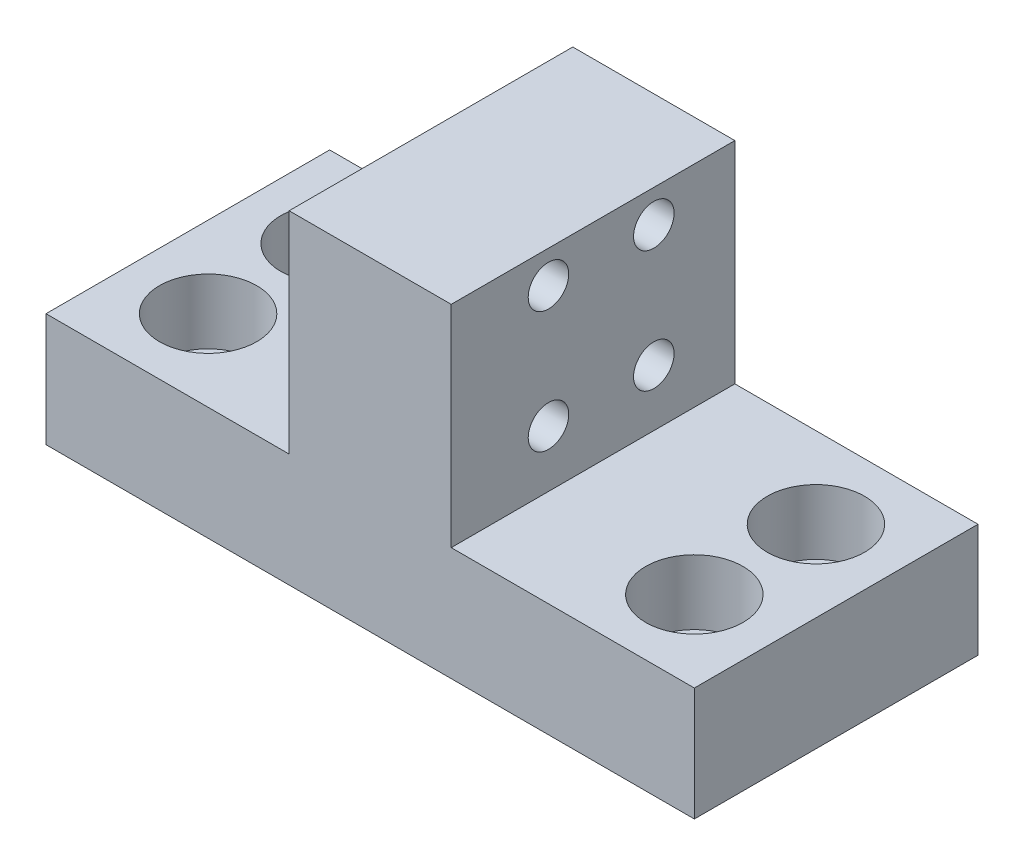
ISO-10303-21;
HEADER;
FILE_DESCRIPTION(('STEP AP214'),'2;1');
FILE_NAME('part.step','',(''),(''),'','','');
FILE_SCHEMA(('AUTOMOTIVE_DESIGN { 1 0 10303 214 1 1 1 1 }'));
ENDSEC;
DATA;
#1=APPLICATION_CONTEXT('core data for automotive mechanical design processes');
#2=APPLICATION_PROTOCOL_DEFINITION('international standard','automotive_design',2000,#1);
#3=PRODUCT_CONTEXT('',#1,'mechanical');
#4=PRODUCT('Part','Part','',(#3));
#5=PRODUCT_RELATED_PRODUCT_CATEGORY('part','',(#4));
#6=PRODUCT_DEFINITION_FORMATION('','',#4);
#7=PRODUCT_DEFINITION_CONTEXT('part definition',#1,'design');
#8=PRODUCT_DEFINITION('design','',#6,#7);
#9=PRODUCT_DEFINITION_SHAPE('','',#8);
#10=(LENGTH_UNIT() NAMED_UNIT(*) SI_UNIT(.MILLI.,.METRE.));
#11=(NAMED_UNIT(*) PLANE_ANGLE_UNIT() SI_UNIT($,.RADIAN.));
#12=(NAMED_UNIT(*) SI_UNIT($,.STERADIAN.) SOLID_ANGLE_UNIT());
#13=UNCERTAINTY_MEASURE_WITH_UNIT(LENGTH_MEASURE(1.E-05),#10,'distance_accuracy_value','');
#14=(GEOMETRIC_REPRESENTATION_CONTEXT(3) GLOBAL_UNCERTAINTY_ASSIGNED_CONTEXT((#13)) GLOBAL_UNIT_ASSIGNED_CONTEXT((#10,
#11,#12)) REPRESENTATION_CONTEXT('',''));
#15=CARTESIAN_POINT('',(0.,0.,0.));
#16=DIRECTION('',(0.,0.,1.));
#17=DIRECTION('',(1.,0.,0.));
#18=AXIS2_PLACEMENT_3D('',#15,#16,#17);
#19=CARTESIAN_POINT('',(40.,36.,5.5));
#20=DIRECTION('',(-1.,0.,0.));
#21=DIRECTION('',(0.,0.,1.));
#22=AXIS2_PLACEMENT_3D('',#19,#20,#21);
#23=CYLINDRICAL_SURFACE('',#22,2.5);
#24=CARTESIAN_POINT('',(-10.,36.,5.5));
#25=DIRECTION('',(-1.,0.,0.));
#26=DIRECTION('',(0.,0.,1.));
#27=AXIS2_PLACEMENT_3D('',#24,#25,#26);
#28=CIRCLE('',#27,2.5);
#29=CARTESIAN_POINT('',(-10.,36.,8.));
#30=VERTEX_POINT('',#29);
#31=EDGE_CURVE('E42',#30,#30,#28,.T.);
#32=ORIENTED_EDGE('',*,*,#31,.T.);
#33=EDGE_LOOP('',(#32));
#34=FACE_BOUND('',#33,.T.);
#35=CARTESIAN_POINT('',(10.,36.,5.5));
#36=DIRECTION('',(-1.,0.,0.));
#37=DIRECTION('',(0.,0.,1.));
#38=AXIS2_PLACEMENT_3D('',#35,#36,#37);
#39=CIRCLE('',#38,2.5);
#40=CARTESIAN_POINT('',(10.,36.,8.));
#41=VERTEX_POINT('',#40);
#42=EDGE_CURVE('E11',#41,#41,#39,.T.);
#43=ORIENTED_EDGE('',*,*,#42,.F.);
#44=EDGE_LOOP('',(#43));
#45=FACE_BOUND('',#44,.T.);
#46=ADVANCED_FACE('F35',(#34,#45),#23,.F.);
#47=CARTESIAN_POINT('',(40.,36.,-7.5));
#48=DIRECTION('',(-1.,0.,0.));
#49=DIRECTION('',(0.,0.,1.));
#50=AXIS2_PLACEMENT_3D('',#47,#48,#49);
#51=CYLINDRICAL_SURFACE('',#50,2.5);
#52=CARTESIAN_POINT('',(-10.,36.,-7.5));
#53=DIRECTION('',(-1.,0.,0.));
#54=DIRECTION('',(0.,0.,1.));
#55=AXIS2_PLACEMENT_3D('',#52,#53,#54);
#56=CIRCLE('',#55,2.5);
#57=CARTESIAN_POINT('',(-10.,36.,-5.));
#58=VERTEX_POINT('',#57);
#59=EDGE_CURVE('E158',#58,#58,#56,.T.);
#60=ORIENTED_EDGE('',*,*,#59,.T.);
#61=EDGE_LOOP('',(#60));
#62=FACE_BOUND('',#61,.T.);
#63=CARTESIAN_POINT('',(10.,36.,-7.5));
#64=DIRECTION('',(-1.,0.,0.));
#65=DIRECTION('',(0.,0.,1.));
#66=AXIS2_PLACEMENT_3D('',#63,#64,#65);
#67=CIRCLE('',#66,2.5);
#68=CARTESIAN_POINT('',(10.,36.,-5.));
#69=VERTEX_POINT('',#68);
#70=EDGE_CURVE('E166',#69,#69,#67,.T.);
#71=ORIENTED_EDGE('',*,*,#70,.F.);
#72=EDGE_LOOP('',(#71));
#73=FACE_BOUND('',#72,.T.);
#74=ADVANCED_FACE('F191',(#62,#73),#51,.F.);
#75=CARTESIAN_POINT('',(0.,14.,0.));
#76=DIRECTION('',(0.,1.,0.));
#77=DIRECTION('',(0.,0.,1.));
#78=AXIS2_PLACEMENT_3D('',#75,#76,#77);
#79=PLANE('',#78);
#80=CARTESIAN_POINT('',(30.,14.,7.5));
#81=DIRECTION('',(0.,1.,0.));
#82=DIRECTION('',(0.,0.,1.));
#83=AXIS2_PLACEMENT_3D('',#80,#81,#82);
#84=CIRCLE('',#83,6.);
#85=CARTESIAN_POINT('',(30.,14.,13.5));
#86=VERTEX_POINT('',#85);
#87=EDGE_CURVE('E162',#86,#86,#84,.T.);
#88=ORIENTED_EDGE('',*,*,#87,.F.);
#89=EDGE_LOOP('',(#88));
#90=FACE_BOUND('',#89,.T.);
#91=CARTESIAN_POINT('',(30.,14.,-7.5));
#92=DIRECTION('',(0.,1.,0.));
#93=DIRECTION('',(0.,0.,1.));
#94=AXIS2_PLACEMENT_3D('',#91,#92,#93);
#95=CIRCLE('',#94,6.);
#96=CARTESIAN_POINT('',(30.,14.,-1.5));
#97=VERTEX_POINT('',#96);
#98=EDGE_CURVE('E477',#97,#97,#95,.T.);
#99=ORIENTED_EDGE('',*,*,#98,.F.);
#100=EDGE_LOOP('',(#99));
#101=FACE_BOUND('',#100,.T.);
#102=DIRECTION('',(0.,0.,-1.));
#103=VECTOR('',#102,1.);
#104=CARTESIAN_POINT('',(10.,14.,17.5));
#105=LINE('',#104,#103);
#106=CARTESIAN_POINT('',(10.,14.,17.5));
#107=VERTEX_POINT('',#106);
#108=CARTESIAN_POINT('',(10.,14.,-17.5));
#109=VERTEX_POINT('',#108);
#110=EDGE_CURVE('E49',#107,#109,#105,.T.);
#111=ORIENTED_EDGE('',*,*,#110,.F.);
#112=DIRECTION('',(1.,0.,0.));
#113=VECTOR('',#112,1.);
#114=CARTESIAN_POINT('',(-40.,14.,17.5));
#115=LINE('',#114,#113);
#116=CARTESIAN_POINT('',(40.,14.,17.5));
#117=VERTEX_POINT('',#116);
#118=EDGE_CURVE('E136',#107,#117,#115,.T.);
#119=ORIENTED_EDGE('',*,*,#118,.T.);
#120=DIRECTION('',(0.,0.,-1.));
#121=VECTOR('',#120,1.);
#122=CARTESIAN_POINT('',(40.,14.,17.5));
#123=LINE('',#122,#121);
#124=CARTESIAN_POINT('',(40.,14.,-17.5));
#125=VERTEX_POINT('',#124);
#126=EDGE_CURVE('E139',#117,#125,#123,.T.);
#127=ORIENTED_EDGE('',*,*,#126,.T.);
#128=DIRECTION('',(-1.,0.,0.));
#129=VECTOR('',#128,1.);
#130=CARTESIAN_POINT('',(40.,14.,-17.5));
#131=LINE('',#130,#129);
#132=EDGE_CURVE('E132',#125,#109,#131,.T.);
#133=ORIENTED_EDGE('',*,*,#132,.T.);
#134=EDGE_LOOP('',(#111,#119,#127,#133));
#135=FACE_BOUND('',#134,.T.);
#136=ADVANCED_FACE('F195',(#90,#101,#135),#79,.T.);
#137=CARTESIAN_POINT('',(40.,14.,-17.5));
#138=DIRECTION('',(0.,0.,1.));
#139=DIRECTION('',(1.,0.,0.));
#140=AXIS2_PLACEMENT_3D('',#137,#138,#139);
#141=PLANE('',#140);
#142=DIRECTION('',(-1.,0.,0.));
#143=VECTOR('',#142,1.);
#144=CARTESIAN_POINT('',(40.,0.,-17.5));
#145=LINE('',#144,#143);
#146=CARTESIAN_POINT('',(40.,0.,-17.5));
#147=VERTEX_POINT('',#146);
#148=CARTESIAN_POINT('',(-40.,0.,-17.5));
#149=VERTEX_POINT('',#148);
#150=EDGE_CURVE('E124',#147,#149,#145,.T.);
#151=ORIENTED_EDGE('',*,*,#150,.T.);
#152=DIRECTION('',(0.,-1.,0.));
#153=VECTOR('',#152,1.);
#154=CARTESIAN_POINT('',(-40.,14.,-17.5));
#155=LINE('',#154,#153);
#156=CARTESIAN_POINT('',(-40.,14.,-17.5));
#157=VERTEX_POINT('',#156);
#158=EDGE_CURVE('E155',#157,#149,#155,.T.);
#159=ORIENTED_EDGE('',*,*,#158,.F.);
#160=CARTESIAN_POINT('',(-10.,14.,-17.5));
#161=VERTEX_POINT('',#160);
#162=EDGE_CURVE('E123',#161,#157,#131,.T.);
#163=ORIENTED_EDGE('',*,*,#162,.F.);
#164=DIRECTION('',(0.,-1.,0.));
#165=VECTOR('',#164,1.);
#166=CARTESIAN_POINT('',(-10.,40.,-17.5));
#167=LINE('',#166,#165);
#168=CARTESIAN_POINT('',(-10.,40.,-17.5));
#169=VERTEX_POINT('',#168);
#170=EDGE_CURVE('E104',#169,#161,#167,.T.);
#171=ORIENTED_EDGE('',*,*,#170,.F.);
#172=DIRECTION('',(-1.,0.,0.));
#173=VECTOR('',#172,1.);
#174=CARTESIAN_POINT('',(10.,40.,-17.5));
#175=LINE('',#174,#173);
#176=CARTESIAN_POINT('',(10.,40.,-17.5));
#177=VERTEX_POINT('',#176);
#178=EDGE_CURVE('E110',#177,#169,#175,.T.);
#179=ORIENTED_EDGE('',*,*,#178,.F.);
#180=DIRECTION('',(0.,-1.,0.));
#181=VECTOR('',#180,1.);
#182=CARTESIAN_POINT('',(10.,40.,-17.5));
#183=LINE('',#182,#181);
#184=EDGE_CURVE('E246',#177,#109,#183,.T.);
#185=ORIENTED_EDGE('',*,*,#184,.T.);
#186=ORIENTED_EDGE('',*,*,#132,.F.);
#187=DIRECTION('',(0.,-1.,0.));
#188=VECTOR('',#187,1.);
#189=CARTESIAN_POINT('',(40.,14.,-17.5));
#190=LINE('',#189,#188);
#191=EDGE_CURVE('E140',#125,#147,#190,.T.);
#192=ORIENTED_EDGE('',*,*,#191,.T.);
#193=EDGE_LOOP('',(#151,#159,#163,#171,#179,#185,#186,#192));
#194=FACE_BOUND('',#193,.T.);
#195=ADVANCED_FACE('F121',(#194),#141,.F.);
#196=CARTESIAN_POINT('',(-40.,14.,-17.5));
#197=DIRECTION('',(1.,0.,0.));
#198=DIRECTION('',(0.,0.,-1.));
#199=AXIS2_PLACEMENT_3D('',#196,#197,#198);
#200=PLANE('',#199);
#201=DIRECTION('',(0.,0.,1.));
#202=VECTOR('',#201,1.);
#203=CARTESIAN_POINT('',(-40.,0.,-17.5));
#204=LINE('',#203,#202);
#205=CARTESIAN_POINT('',(-40.,0.,17.5));
#206=VERTEX_POINT('',#205);
#207=EDGE_CURVE('E126',#149,#206,#204,.T.);
#208=ORIENTED_EDGE('',*,*,#207,.T.);
#209=DIRECTION('',(0.,-1.,0.));
#210=VECTOR('',#209,1.);
#211=CARTESIAN_POINT('',(-40.,14.,17.5));
#212=LINE('',#211,#210);
#213=CARTESIAN_POINT('',(-40.,14.,17.5));
#214=VERTEX_POINT('',#213);
#215=EDGE_CURVE('E152',#214,#206,#212,.T.);
#216=ORIENTED_EDGE('',*,*,#215,.F.);
#217=DIRECTION('',(0.,0.,1.));
#218=VECTOR('',#217,1.);
#219=CARTESIAN_POINT('',(-40.,14.,-17.5));
#220=LINE('',#219,#218);
#221=EDGE_CURVE('E134',#157,#214,#220,.T.);
#222=ORIENTED_EDGE('',*,*,#221,.F.);
#223=ORIENTED_EDGE('',*,*,#158,.T.);
#224=EDGE_LOOP('',(#208,#216,#222,#223));
#225=FACE_BOUND('',#224,.T.);
#226=ADVANCED_FACE('F205',(#225),#200,.F.);
#227=CARTESIAN_POINT('',(-40.,14.,17.5));
#228=DIRECTION('',(0.,0.,-1.));
#229=DIRECTION('',(-1.,0.,0.));
#230=AXIS2_PLACEMENT_3D('',#227,#228,#229);
#231=PLANE('',#230);
#232=DIRECTION('',(1.,0.,0.));
#233=VECTOR('',#232,1.);
#234=CARTESIAN_POINT('',(-40.,0.,17.5));
#235=LINE('',#234,#233);
#236=CARTESIAN_POINT('',(40.,0.,17.5));
#237=VERTEX_POINT('',#236);
#238=EDGE_CURVE('E143',#206,#237,#235,.T.);
#239=ORIENTED_EDGE('',*,*,#238,.T.);
#240=DIRECTION('',(0.,-1.,0.));
#241=VECTOR('',#240,1.);
#242=CARTESIAN_POINT('',(40.,14.,17.5));
#243=LINE('',#242,#241);
#244=EDGE_CURVE('E149',#117,#237,#243,.T.);
#245=ORIENTED_EDGE('',*,*,#244,.F.);
#246=ORIENTED_EDGE('',*,*,#118,.F.);
#247=DIRECTION('',(0.,-1.,0.));
#248=VECTOR('',#247,1.);
#249=CARTESIAN_POINT('',(10.,40.,17.5));
#250=LINE('',#249,#248);
#251=CARTESIAN_POINT('',(10.,40.,17.5));
#252=VERTEX_POINT('',#251);
#253=EDGE_CURVE('E128',#252,#107,#250,.T.);
#254=ORIENTED_EDGE('',*,*,#253,.F.);
#255=DIRECTION('',(1.,0.,0.));
#256=VECTOR('',#255,1.);
#257=CARTESIAN_POINT('',(10.,40.,17.5));
#258=LINE('',#257,#256);
#259=CARTESIAN_POINT('',(-10.,40.,17.5));
#260=VERTEX_POINT('',#259);
#261=EDGE_CURVE('E109',#260,#252,#258,.T.);
#262=ORIENTED_EDGE('',*,*,#261,.F.);
#263=DIRECTION('',(0.,-1.,0.));
#264=VECTOR('',#263,1.);
#265=CARTESIAN_POINT('',(-10.,40.,17.5));
#266=LINE('',#265,#264);
#267=CARTESIAN_POINT('',(-10.,14.,17.5));
#268=VERTEX_POINT('',#267);
#269=EDGE_CURVE('E106',#260,#268,#266,.T.);
#270=ORIENTED_EDGE('',*,*,#269,.T.);
#271=EDGE_CURVE('E137',#214,#268,#115,.T.);
#272=ORIENTED_EDGE('',*,*,#271,.F.);
#273=ORIENTED_EDGE('',*,*,#215,.T.);
#274=EDGE_LOOP('',(#239,#245,#246,#254,#262,#270,#272,#273));
#275=FACE_BOUND('',#274,.T.);
#276=ADVANCED_FACE('F208',(#275),#231,.F.);
#277=CARTESIAN_POINT('',(40.,14.,17.5));
#278=DIRECTION('',(-1.,0.,0.));
#279=DIRECTION('',(0.,0.,1.));
#280=AXIS2_PLACEMENT_3D('',#277,#278,#279);
#281=PLANE('',#280);
#282=DIRECTION('',(0.,0.,-1.));
#283=VECTOR('',#282,1.);
#284=CARTESIAN_POINT('',(40.,0.,17.5));
#285=LINE('',#284,#283);
#286=EDGE_CURVE('E145',#237,#147,#285,.T.);
#287=ORIENTED_EDGE('',*,*,#286,.T.);
#288=ORIENTED_EDGE('',*,*,#191,.F.);
#289=ORIENTED_EDGE('',*,*,#126,.F.);
#290=ORIENTED_EDGE('',*,*,#244,.T.);
#291=EDGE_LOOP('',(#287,#288,#289,#290));
#292=FACE_BOUND('',#291,.T.);
#293=ADVANCED_FACE('F212',(#292),#281,.F.);
#294=CARTESIAN_POINT('',(-30.,14.,7.5));
#295=DIRECTION('',(0.,1.,0.));
#296=DIRECTION('',(0.,0.,1.));
#297=AXIS2_PLACEMENT_3D('',#294,#295,#296);
#298=CIRCLE('',#297,6.);
#299=CARTESIAN_POINT('',(-30.,14.,13.5));
#300=VERTEX_POINT('',#299);
#301=EDGE_CURVE('E223',#300,#300,#298,.T.);
#302=ORIENTED_EDGE('',*,*,#301,.F.);
#303=EDGE_LOOP('',(#302));
#304=FACE_BOUND('',#303,.T.);
#305=CARTESIAN_POINT('',(-30.,14.,-7.5));
#306=DIRECTION('',(0.,1.,0.));
#307=DIRECTION('',(0.,0.,1.));
#308=AXIS2_PLACEMENT_3D('',#305,#306,#307);
#309=CIRCLE('',#308,6.);
#310=CARTESIAN_POINT('',(-30.,14.,-1.5));
#311=VERTEX_POINT('',#310);
#312=EDGE_CURVE('E226',#311,#311,#309,.T.);
#313=ORIENTED_EDGE('',*,*,#312,.F.);
#314=EDGE_LOOP('',(#313));
#315=FACE_BOUND('',#314,.T.);
#316=DIRECTION('',(0.,0.,1.));
#317=VECTOR('',#316,1.);
#318=CARTESIAN_POINT('',(-10.,14.,-17.5));
#319=LINE('',#318,#317);
#320=EDGE_CURVE('E57',#161,#268,#319,.T.);
#321=ORIENTED_EDGE('',*,*,#320,.F.);
#322=ORIENTED_EDGE('',*,*,#162,.T.);
#323=ORIENTED_EDGE('',*,*,#221,.T.);
#324=ORIENTED_EDGE('',*,*,#271,.T.);
#325=EDGE_LOOP('',(#321,#322,#323,#324));
#326=FACE_BOUND('',#325,.T.);
#327=ADVANCED_FACE('F184',(#304,#315,#326),#79,.T.);
#328=CARTESIAN_POINT('',(0.,0.,0.));
#329=DIRECTION('',(0.,1.,0.));
#330=DIRECTION('',(0.,0.,1.));
#331=AXIS2_PLACEMENT_3D('',#328,#329,#330);
#332=PLANE('',#331);
#333=CARTESIAN_POINT('',(30.,0.,7.5));
#334=DIRECTION('',(0.,1.,0.));
#335=DIRECTION('',(0.,0.,1.));
#336=AXIS2_PLACEMENT_3D('',#333,#334,#335);
#337=CIRCLE('',#336,3.5);
#338=CARTESIAN_POINT('',(30.,0.,11.));
#339=VERTEX_POINT('',#338);
#340=EDGE_CURVE('E474',#339,#339,#337,.T.);
#341=ORIENTED_EDGE('',*,*,#340,.T.);
#342=EDGE_LOOP('',(#341));
#343=FACE_BOUND('',#342,.T.);
#344=CARTESIAN_POINT('',(30.,0.,-7.5));
#345=DIRECTION('',(0.,1.,0.));
#346=DIRECTION('',(0.,0.,1.));
#347=AXIS2_PLACEMENT_3D('',#344,#345,#346);
#348=CIRCLE('',#347,3.5);
#349=CARTESIAN_POINT('',(30.,0.,-4.));
#350=VERTEX_POINT('',#349);
#351=EDGE_CURVE('E486',#350,#350,#348,.T.);
#352=ORIENTED_EDGE('',*,*,#351,.T.);
#353=EDGE_LOOP('',(#352));
#354=FACE_BOUND('',#353,.T.);
#355=CARTESIAN_POINT('',(-30.,0.,7.5));
#356=DIRECTION('',(0.,1.,0.));
#357=DIRECTION('',(0.,0.,1.));
#358=AXIS2_PLACEMENT_3D('',#355,#356,#357);
#359=CIRCLE('',#358,3.5);
#360=CARTESIAN_POINT('',(-30.,0.,11.));
#361=VERTEX_POINT('',#360);
#362=EDGE_CURVE('E229',#361,#361,#359,.T.);
#363=ORIENTED_EDGE('',*,*,#362,.T.);
#364=EDGE_LOOP('',(#363));
#365=FACE_BOUND('',#364,.T.);
#366=CARTESIAN_POINT('',(-30.,0.,-7.5));
#367=DIRECTION('',(0.,1.,0.));
#368=DIRECTION('',(0.,0.,1.));
#369=AXIS2_PLACEMENT_3D('',#366,#367,#368);
#370=CIRCLE('',#369,3.5);
#371=CARTESIAN_POINT('',(-30.,0.,-4.));
#372=VERTEX_POINT('',#371);
#373=EDGE_CURVE('E241',#372,#372,#370,.T.);
#374=ORIENTED_EDGE('',*,*,#373,.T.);
#375=EDGE_LOOP('',(#374));
#376=FACE_BOUND('',#375,.T.);
#377=ORIENTED_EDGE('',*,*,#150,.F.);
#378=ORIENTED_EDGE('',*,*,#286,.F.);
#379=ORIENTED_EDGE('',*,*,#238,.F.);
#380=ORIENTED_EDGE('',*,*,#207,.F.);
#381=EDGE_LOOP('',(#377,#378,#379,#380));
#382=FACE_BOUND('',#381,.T.);
#383=ADVANCED_FACE('F175',(#343,#354,#365,#376,#382),#332,.F.);
#384=CARTESIAN_POINT('',(-10.,40.,-17.5));
#385=DIRECTION('',(1.,0.,0.));
#386=DIRECTION('',(0.,0.,-1.));
#387=AXIS2_PLACEMENT_3D('',#384,#385,#386);
#388=PLANE('',#387);
#389=CARTESIAN_POINT('',(-10.,21.,5.5));
#390=DIRECTION('',(-1.,0.,0.));
#391=DIRECTION('',(0.,0.,1.));
#392=AXIS2_PLACEMENT_3D('',#389,#390,#391);
#393=CIRCLE('',#392,2.5);
#394=CARTESIAN_POINT('',(-10.,21.,8.));
#395=VERTEX_POINT('',#394);
#396=EDGE_CURVE('E457',#395,#395,#393,.T.);
#397=ORIENTED_EDGE('',*,*,#396,.F.);
#398=EDGE_LOOP('',(#397));
#399=FACE_BOUND('',#398,.T.);
#400=CARTESIAN_POINT('',(-10.,21.,-7.5));
#401=DIRECTION('',(-1.,0.,0.));
#402=DIRECTION('',(0.,0.,1.));
#403=AXIS2_PLACEMENT_3D('',#400,#401,#402);
#404=CIRCLE('',#403,2.5);
#405=CARTESIAN_POINT('',(-10.,21.,-5.));
#406=VERTEX_POINT('',#405);
#407=EDGE_CURVE('E163',#406,#406,#404,.T.);
#408=ORIENTED_EDGE('',*,*,#407,.F.);
#409=EDGE_LOOP('',(#408));
#410=FACE_BOUND('',#409,.T.);
#411=ORIENTED_EDGE('',*,*,#320,.T.);
#412=ORIENTED_EDGE('',*,*,#269,.F.);
#413=DIRECTION('',(0.,0.,1.));
#414=VECTOR('',#413,1.);
#415=CARTESIAN_POINT('',(-10.,40.,-17.5));
#416=LINE('',#415,#414);
#417=EDGE_CURVE('E99',#169,#260,#416,.T.);
#418=ORIENTED_EDGE('',*,*,#417,.F.);
#419=ORIENTED_EDGE('',*,*,#170,.T.);
#420=EDGE_LOOP('',(#411,#412,#418,#419));
#421=FACE_BOUND('',#420,.T.);
#422=ORIENTED_EDGE('',*,*,#59,.F.);
#423=EDGE_LOOP('',(#422));
#424=FACE_BOUND('',#423,.T.);
#425=ORIENTED_EDGE('',*,*,#31,.F.);
#426=EDGE_LOOP('',(#425));
#427=FACE_BOUND('',#426,.T.);
#428=ADVANCED_FACE('F101',(#399,#410,#421,#424,#427),#388,.F.);
#429=CARTESIAN_POINT('',(10.,40.,17.5));
#430=DIRECTION('',(-1.,0.,0.));
#431=DIRECTION('',(0.,0.,1.));
#432=AXIS2_PLACEMENT_3D('',#429,#430,#431);
#433=PLANE('',#432);
#434=CARTESIAN_POINT('',(10.,21.,5.5));
#435=DIRECTION('',(-1.,0.,0.));
#436=DIRECTION('',(0.,0.,1.));
#437=AXIS2_PLACEMENT_3D('',#434,#435,#436);
#438=CIRCLE('',#437,2.5);
#439=CARTESIAN_POINT('',(10.,21.,8.));
#440=VERTEX_POINT('',#439);
#441=EDGE_CURVE('E460',#440,#440,#438,.T.);
#442=ORIENTED_EDGE('',*,*,#441,.T.);
#443=EDGE_LOOP('',(#442));
#444=FACE_BOUND('',#443,.T.);
#445=CARTESIAN_POINT('',(10.,21.,-7.5));
#446=DIRECTION('',(-1.,0.,0.));
#447=DIRECTION('',(0.,0.,1.));
#448=AXIS2_PLACEMENT_3D('',#445,#446,#447);
#449=CIRCLE('',#448,2.5);
#450=CARTESIAN_POINT('',(10.,21.,-5.));
#451=VERTEX_POINT('',#450);
#452=EDGE_CURVE('E159',#451,#451,#449,.T.);
#453=ORIENTED_EDGE('',*,*,#452,.T.);
#454=EDGE_LOOP('',(#453));
#455=FACE_BOUND('',#454,.T.);
#456=ORIENTED_EDGE('',*,*,#110,.T.);
#457=ORIENTED_EDGE('',*,*,#184,.F.);
#458=DIRECTION('',(0.,0.,-1.));
#459=VECTOR('',#458,1.);
#460=CARTESIAN_POINT('',(10.,40.,17.5));
#461=LINE('',#460,#459);
#462=EDGE_CURVE('E115',#252,#177,#461,.T.);
#463=ORIENTED_EDGE('',*,*,#462,.F.);
#464=ORIENTED_EDGE('',*,*,#253,.T.);
#465=EDGE_LOOP('',(#456,#457,#463,#464));
#466=FACE_BOUND('',#465,.T.);
#467=ORIENTED_EDGE('',*,*,#70,.T.);
#468=EDGE_LOOP('',(#467));
#469=FACE_BOUND('',#468,.T.);
#470=ORIENTED_EDGE('',*,*,#42,.T.);
#471=EDGE_LOOP('',(#470));
#472=FACE_BOUND('',#471,.T.);
#473=ADVANCED_FACE('F174',(#444,#455,#466,#469,#472),#433,.F.);
#474=CARTESIAN_POINT('',(0.,40.,0.));
#475=DIRECTION('',(0.,1.,0.));
#476=DIRECTION('',(0.,0.,1.));
#477=AXIS2_PLACEMENT_3D('',#474,#475,#476);
#478=PLANE('',#477);
#479=ORIENTED_EDGE('',*,*,#178,.T.);
#480=ORIENTED_EDGE('',*,*,#417,.T.);
#481=ORIENTED_EDGE('',*,*,#261,.T.);
#482=ORIENTED_EDGE('',*,*,#462,.T.);
#483=EDGE_LOOP('',(#479,#480,#481,#482));
#484=FACE_BOUND('',#483,.T.);
#485=ADVANCED_FACE('F113',(#484),#478,.T.);
#486=CARTESIAN_POINT('',(-30.,14.,-7.5));
#487=DIRECTION('',(0.,1.,0.));
#488=DIRECTION('',(0.,0.,1.));
#489=AXIS2_PLACEMENT_3D('',#486,#487,#488);
#490=CYLINDRICAL_SURFACE('',#489,3.5);
#491=ORIENTED_EDGE('',*,*,#373,.F.);
#492=EDGE_LOOP('',(#491));
#493=FACE_BOUND('',#492,.T.);
#494=CARTESIAN_POINT('',(-30.,6.,-7.5));
#495=DIRECTION('',(0.,1.,0.));
#496=DIRECTION('',(0.,0.,1.));
#497=AXIS2_PLACEMENT_3D('',#494,#495,#496);
#498=CIRCLE('',#497,3.5);
#499=CARTESIAN_POINT('',(-30.,6.,-4.));
#500=VERTEX_POINT('',#499);
#501=EDGE_CURVE('E232',#500,#500,#498,.T.);
#502=ORIENTED_EDGE('',*,*,#501,.T.);
#503=EDGE_LOOP('',(#502));
#504=FACE_BOUND('',#503,.T.);
#505=ADVANCED_FACE('F270',(#493,#504),#490,.F.);
#506=CARTESIAN_POINT('',(-26.5,6.,-7.5));
#507=DIRECTION('',(0.,-1.,0.));
#508=DIRECTION('',(0.,0.,-1.));
#509=AXIS2_PLACEMENT_3D('',#506,#507,#508);
#510=PLANE('',#509);
#511=ORIENTED_EDGE('',*,*,#501,.F.);
#512=EDGE_LOOP('',(#511));
#513=FACE_BOUND('',#512,.T.);
#514=CARTESIAN_POINT('',(-30.,6.,-7.5));
#515=DIRECTION('',(0.,1.,0.));
#516=DIRECTION('',(0.,0.,1.));
#517=AXIS2_PLACEMENT_3D('',#514,#515,#516);
#518=CIRCLE('',#517,6.);
#519=CARTESIAN_POINT('',(-30.,6.,-1.5));
#520=VERTEX_POINT('',#519);
#521=EDGE_CURVE('E228',#520,#520,#518,.T.);
#522=ORIENTED_EDGE('',*,*,#521,.T.);
#523=EDGE_LOOP('',(#522));
#524=FACE_BOUND('',#523,.T.);
#525=ADVANCED_FACE('F273',(#513,#524),#510,.F.);
#526=CARTESIAN_POINT('',(-30.,14.,-7.5));
#527=DIRECTION('',(0.,1.,0.));
#528=DIRECTION('',(0.,0.,1.));
#529=AXIS2_PLACEMENT_3D('',#526,#527,#528);
#530=CYLINDRICAL_SURFACE('',#529,6.);
#531=ORIENTED_EDGE('',*,*,#521,.F.);
#532=EDGE_LOOP('',(#531));
#533=FACE_BOUND('',#532,.T.);
#534=ORIENTED_EDGE('',*,*,#312,.T.);
#535=EDGE_LOOP('',(#534));
#536=FACE_BOUND('',#535,.T.);
#537=ADVANCED_FACE('F279',(#533,#536),#530,.F.);
#538=CARTESIAN_POINT('',(-30.,14.,7.5));
#539=DIRECTION('',(0.,1.,0.));
#540=DIRECTION('',(0.,0.,1.));
#541=AXIS2_PLACEMENT_3D('',#538,#539,#540);
#542=CYLINDRICAL_SURFACE('',#541,3.5);
#543=ORIENTED_EDGE('',*,*,#362,.F.);
#544=EDGE_LOOP('',(#543));
#545=FACE_BOUND('',#544,.T.);
#546=CARTESIAN_POINT('',(-30.,6.,7.5));
#547=DIRECTION('',(0.,1.,0.));
#548=DIRECTION('',(0.,0.,1.));
#549=AXIS2_PLACEMENT_3D('',#546,#547,#548);
#550=CIRCLE('',#549,3.5);
#551=CARTESIAN_POINT('',(-30.,6.,11.));
#552=VERTEX_POINT('',#551);
#553=EDGE_CURVE('E235',#552,#552,#550,.T.);
#554=ORIENTED_EDGE('',*,*,#553,.T.);
#555=EDGE_LOOP('',(#554));
#556=FACE_BOUND('',#555,.T.);
#557=ADVANCED_FACE('F284',(#545,#556),#542,.F.);
#558=CARTESIAN_POINT('',(-26.5,6.,7.5));
#559=DIRECTION('',(0.,-1.,0.));
#560=DIRECTION('',(0.,0.,-1.));
#561=AXIS2_PLACEMENT_3D('',#558,#559,#560);
#562=PLANE('',#561);
#563=ORIENTED_EDGE('',*,*,#553,.F.);
#564=EDGE_LOOP('',(#563));
#565=FACE_BOUND('',#564,.T.);
#566=CARTESIAN_POINT('',(-30.,6.,7.5));
#567=DIRECTION('',(0.,1.,0.));
#568=DIRECTION('',(0.,0.,1.));
#569=AXIS2_PLACEMENT_3D('',#566,#567,#568);
#570=CIRCLE('',#569,6.);
#571=CARTESIAN_POINT('',(-30.,6.,13.5));
#572=VERTEX_POINT('',#571);
#573=EDGE_CURVE('E490',#572,#572,#570,.T.);
#574=ORIENTED_EDGE('',*,*,#573,.T.);
#575=EDGE_LOOP('',(#574));
#576=FACE_BOUND('',#575,.T.);
#577=ADVANCED_FACE('F289',(#565,#576),#562,.F.);
#578=CARTESIAN_POINT('',(-30.,14.,7.5));
#579=DIRECTION('',(0.,1.,0.));
#580=DIRECTION('',(0.,0.,1.));
#581=AXIS2_PLACEMENT_3D('',#578,#579,#580);
#582=CYLINDRICAL_SURFACE('',#581,6.);
#583=ORIENTED_EDGE('',*,*,#573,.F.);
#584=EDGE_LOOP('',(#583));
#585=FACE_BOUND('',#584,.T.);
#586=ORIENTED_EDGE('',*,*,#301,.T.);
#587=EDGE_LOOP('',(#586));
#588=FACE_BOUND('',#587,.T.);
#589=ADVANCED_FACE('F345',(#585,#588),#582,.F.);
#590=CARTESIAN_POINT('',(30.,14.,-7.5));
#591=DIRECTION('',(0.,1.,0.));
#592=DIRECTION('',(0.,0.,1.));
#593=AXIS2_PLACEMENT_3D('',#590,#591,#592);
#594=CYLINDRICAL_SURFACE('',#593,3.5);
#595=ORIENTED_EDGE('',*,*,#351,.F.);
#596=EDGE_LOOP('',(#595));
#597=FACE_BOUND('',#596,.T.);
#598=CARTESIAN_POINT('',(30.,6.,-7.5));
#599=DIRECTION('',(0.,1.,0.));
#600=DIRECTION('',(0.,0.,1.));
#601=AXIS2_PLACEMENT_3D('',#598,#599,#600);
#602=CIRCLE('',#601,3.5);
#603=CARTESIAN_POINT('',(30.,6.,-4.));
#604=VERTEX_POINT('',#603);
#605=EDGE_CURVE('E483',#604,#604,#602,.T.);
#606=ORIENTED_EDGE('',*,*,#605,.T.);
#607=EDGE_LOOP('',(#606));
#608=FACE_BOUND('',#607,.T.);
#609=ADVANCED_FACE('F354',(#597,#608),#594,.F.);
#610=CARTESIAN_POINT('',(33.5,6.,-7.5));
#611=DIRECTION('',(0.,-1.,0.));
#612=DIRECTION('',(0.,0.,-1.));
#613=AXIS2_PLACEMENT_3D('',#610,#611,#612);
#614=PLANE('',#613);
#615=ORIENTED_EDGE('',*,*,#605,.F.);
#616=EDGE_LOOP('',(#615));
#617=FACE_BOUND('',#616,.T.);
#618=CARTESIAN_POINT('',(30.,6.,-7.5));
#619=DIRECTION('',(0.,1.,0.));
#620=DIRECTION('',(0.,0.,1.));
#621=AXIS2_PLACEMENT_3D('',#618,#619,#620);
#622=CIRCLE('',#621,6.);
#623=CARTESIAN_POINT('',(30.,6.,-1.5));
#624=VERTEX_POINT('',#623);
#625=EDGE_CURVE('E480',#624,#624,#622,.T.);
#626=ORIENTED_EDGE('',*,*,#625,.T.);
#627=EDGE_LOOP('',(#626));
#628=FACE_BOUND('',#627,.T.);
#629=ADVANCED_FACE('F364',(#617,#628),#614,.F.);
#630=CARTESIAN_POINT('',(30.,14.,-7.5));
#631=DIRECTION('',(0.,1.,0.));
#632=DIRECTION('',(0.,0.,1.));
#633=AXIS2_PLACEMENT_3D('',#630,#631,#632);
#634=CYLINDRICAL_SURFACE('',#633,6.);
#635=ORIENTED_EDGE('',*,*,#625,.F.);
#636=EDGE_LOOP('',(#635));
#637=FACE_BOUND('',#636,.T.);
#638=ORIENTED_EDGE('',*,*,#98,.T.);
#639=EDGE_LOOP('',(#638));
#640=FACE_BOUND('',#639,.T.);
#641=ADVANCED_FACE('F374',(#637,#640),#634,.F.);
#642=CARTESIAN_POINT('',(30.,14.,7.5));
#643=DIRECTION('',(0.,1.,0.));
#644=DIRECTION('',(0.,0.,1.));
#645=AXIS2_PLACEMENT_3D('',#642,#643,#644);
#646=CYLINDRICAL_SURFACE('',#645,3.5);
#647=ORIENTED_EDGE('',*,*,#340,.F.);
#648=EDGE_LOOP('',(#647));
#649=FACE_BOUND('',#648,.T.);
#650=CARTESIAN_POINT('',(30.,6.,7.5));
#651=DIRECTION('',(0.,1.,0.));
#652=DIRECTION('',(0.,0.,1.));
#653=AXIS2_PLACEMENT_3D('',#650,#651,#652);
#654=CIRCLE('',#653,3.5);
#655=CARTESIAN_POINT('',(30.,6.,11.));
#656=VERTEX_POINT('',#655);
#657=EDGE_CURVE('E471',#656,#656,#654,.T.);
#658=ORIENTED_EDGE('',*,*,#657,.T.);
#659=EDGE_LOOP('',(#658));
#660=FACE_BOUND('',#659,.T.);
#661=ADVANCED_FACE('F384',(#649,#660),#646,.F.);
#662=CARTESIAN_POINT('',(33.5,6.,7.5));
#663=DIRECTION('',(0.,-1.,0.));
#664=DIRECTION('',(0.,0.,-1.));
#665=AXIS2_PLACEMENT_3D('',#662,#663,#664);
#666=PLANE('',#665);
#667=ORIENTED_EDGE('',*,*,#657,.F.);
#668=EDGE_LOOP('',(#667));
#669=FACE_BOUND('',#668,.T.);
#670=CARTESIAN_POINT('',(30.,6.,7.5));
#671=DIRECTION('',(0.,1.,0.));
#672=DIRECTION('',(0.,0.,1.));
#673=AXIS2_PLACEMENT_3D('',#670,#671,#672);
#674=CIRCLE('',#673,6.);
#675=CARTESIAN_POINT('',(30.,6.,13.5));
#676=VERTEX_POINT('',#675);
#677=EDGE_CURVE('E468',#676,#676,#674,.T.);
#678=ORIENTED_EDGE('',*,*,#677,.T.);
#679=EDGE_LOOP('',(#678));
#680=FACE_BOUND('',#679,.T.);
#681=ADVANCED_FACE('F394',(#669,#680),#666,.F.);
#682=CARTESIAN_POINT('',(30.,14.,7.5));
#683=DIRECTION('',(0.,1.,0.));
#684=DIRECTION('',(0.,0.,1.));
#685=AXIS2_PLACEMENT_3D('',#682,#683,#684);
#686=CYLINDRICAL_SURFACE('',#685,6.);
#687=ORIENTED_EDGE('',*,*,#677,.F.);
#688=EDGE_LOOP('',(#687));
#689=FACE_BOUND('',#688,.T.);
#690=ORIENTED_EDGE('',*,*,#87,.T.);
#691=EDGE_LOOP('',(#690));
#692=FACE_BOUND('',#691,.T.);
#693=ADVANCED_FACE('F404',(#689,#692),#686,.F.);
#694=CARTESIAN_POINT('',(40.,21.,-7.5));
#695=DIRECTION('',(-1.,0.,0.));
#696=DIRECTION('',(0.,0.,1.));
#697=AXIS2_PLACEMENT_3D('',#694,#695,#696);
#698=CYLINDRICAL_SURFACE('',#697,2.5);
#699=ORIENTED_EDGE('',*,*,#407,.T.);
#700=EDGE_LOOP('',(#699));
#701=FACE_BOUND('',#700,.T.);
#702=ORIENTED_EDGE('',*,*,#452,.F.);
#703=EDGE_LOOP('',(#702));
#704=FACE_BOUND('',#703,.T.);
#705=ADVANCED_FACE('F414',(#701,#704),#698,.F.);
#706=CARTESIAN_POINT('',(40.,21.,5.5));
#707=DIRECTION('',(-1.,0.,0.));
#708=DIRECTION('',(0.,0.,1.));
#709=AXIS2_PLACEMENT_3D('',#706,#707,#708);
#710=CYLINDRICAL_SURFACE('',#709,2.5);
#711=ORIENTED_EDGE('',*,*,#396,.T.);
#712=EDGE_LOOP('',(#711));
#713=FACE_BOUND('',#712,.T.);
#714=ORIENTED_EDGE('',*,*,#441,.F.);
#715=EDGE_LOOP('',(#714));
#716=FACE_BOUND('',#715,.T.);
#717=ADVANCED_FACE('F423',(#713,#716),#710,.F.);
#718=CLOSED_SHELL('',(#46,#74,#136,#195,#226,#276,#293,#327,#383,#428,#473,#485,#505,#525,#537,
#557,#577,#589,#609,#629,#641,#661,#681,#693,#705,#717));
#719=MANIFOLD_SOLID_BREP('B2',#718);
#720=ADVANCED_BREP_SHAPE_REPRESENTATION('',(#18,#719),#14);
#721=SHAPE_DEFINITION_REPRESENTATION(#9,#720);
ENDSEC;
END-ISO-10303-21;
